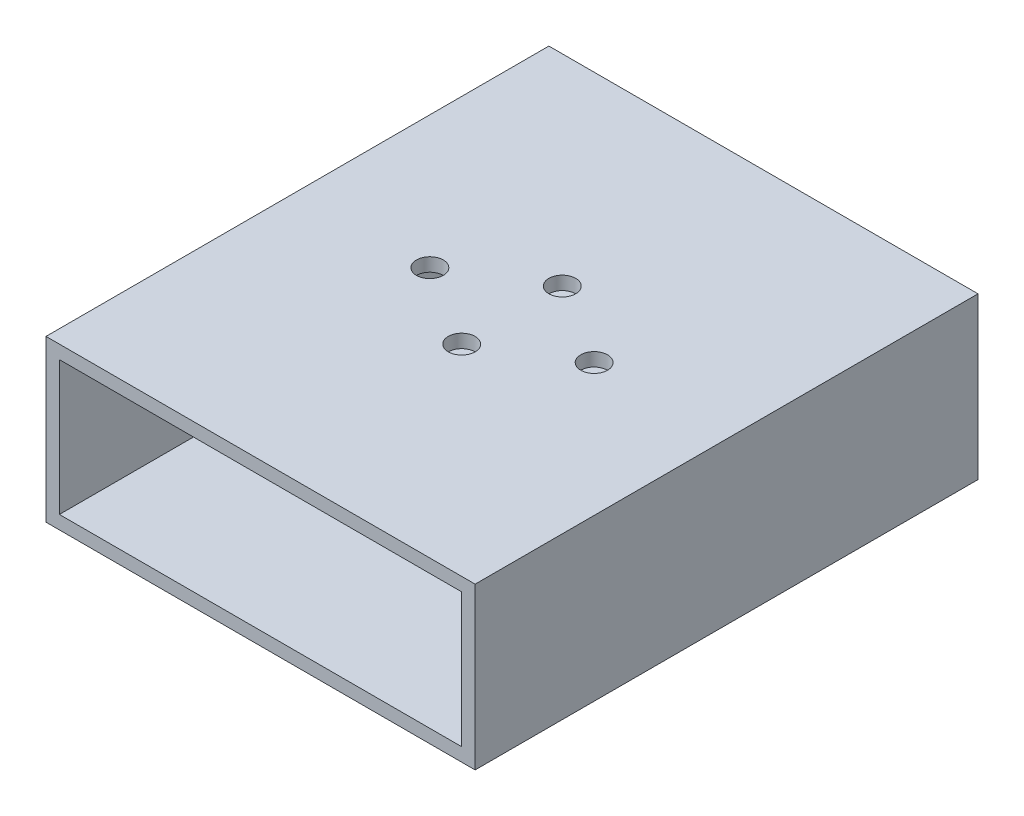
ISO-10303-21;
HEADER;
FILE_DESCRIPTION(('STEP AP214'),'2;1');
FILE_NAME('part.step','',(''),(''),'','','');
FILE_SCHEMA(('AUTOMOTIVE_DESIGN { 1 0 10303 214 1 1 1 1 }'));
ENDSEC;
DATA;
#1=APPLICATION_CONTEXT('core data for automotive mechanical design processes');
#2=APPLICATION_PROTOCOL_DEFINITION('international standard','automotive_design',2000,#1);
#3=PRODUCT_CONTEXT('',#1,'mechanical');
#4=PRODUCT('Part','Part','',(#3));
#5=PRODUCT_RELATED_PRODUCT_CATEGORY('part','',(#4));
#6=PRODUCT_DEFINITION_FORMATION('','',#4);
#7=PRODUCT_DEFINITION_CONTEXT('part definition',#1,'design');
#8=PRODUCT_DEFINITION('design','',#6,#7);
#9=PRODUCT_DEFINITION_SHAPE('','',#8);
#10=(LENGTH_UNIT() NAMED_UNIT(*) SI_UNIT(.MILLI.,.METRE.));
#11=(NAMED_UNIT(*) PLANE_ANGLE_UNIT() SI_UNIT($,.RADIAN.));
#12=(NAMED_UNIT(*) SI_UNIT($,.STERADIAN.) SOLID_ANGLE_UNIT());
#13=UNCERTAINTY_MEASURE_WITH_UNIT(LENGTH_MEASURE(1.E-05),#10,'distance_accuracy_value','');
#14=(GEOMETRIC_REPRESENTATION_CONTEXT(3) GLOBAL_UNCERTAINTY_ASSIGNED_CONTEXT((#13)) GLOBAL_UNIT_ASSIGNED_CONTEXT((#10,
#11,#12)) REPRESENTATION_CONTEXT('',''));
#15=CARTESIAN_POINT('',(0.,0.,0.));
#16=DIRECTION('',(0.,0.,1.));
#17=DIRECTION('',(1.,0.,0.));
#18=AXIS2_PLACEMENT_3D('',#15,#16,#17);
#19=CARTESIAN_POINT('',(0.,0.,150.));
#20=DIRECTION('',(0.,0.,1.));
#21=DIRECTION('',(1.,0.,0.));
#22=AXIS2_PLACEMENT_3D('',#19,#20,#21);
#23=PLANE('',#22);
#24=DIRECTION('',(0.,1.,0.));
#25=VECTOR('',#24,1.);
#26=CARTESIAN_POINT('',(4.,0.,150.));
#27=LINE('',#26,#25);
#28=CARTESIAN_POINT('',(4.,-4.,150.));
#29=VERTEX_POINT('',#28);
#30=CARTESIAN_POINT('',(4.,44.,150.));
#31=VERTEX_POINT('',#30);
#32=EDGE_CURVE('E162',#29,#31,#27,.T.);
#33=ORIENTED_EDGE('',*,*,#32,.T.);
#34=DIRECTION('',(-1.,0.,0.));
#35=VECTOR('',#34,1.);
#36=CARTESIAN_POINT('',(0.,44.,150.));
#37=LINE('',#36,#35);
#38=CARTESIAN_POINT('',(-124.,44.,150.));
#39=VERTEX_POINT('',#38);
#40=EDGE_CURVE('E165',#31,#39,#37,.T.);
#41=ORIENTED_EDGE('',*,*,#40,.T.);
#42=DIRECTION('',(0.,-1.,0.));
#43=VECTOR('',#42,1.);
#44=CARTESIAN_POINT('',(-124.,0.,150.));
#45=LINE('',#44,#43);
#46=CARTESIAN_POINT('',(-124.,-4.00000000000002,150.));
#47=VERTEX_POINT('',#46);
#48=EDGE_CURVE('E168',#39,#47,#45,.T.);
#49=ORIENTED_EDGE('',*,*,#48,.T.);
#50=DIRECTION('',(1.,0.,0.));
#51=VECTOR('',#50,1.);
#52=CARTESIAN_POINT('',(0.,-4.,150.));
#53=LINE('',#52,#51);
#54=EDGE_CURVE('E170',#47,#29,#53,.T.);
#55=ORIENTED_EDGE('',*,*,#54,.T.);
#56=EDGE_LOOP('',(#33,#41,#49,#55));
#57=FACE_BOUND('',#56,.T.);
#58=DIRECTION('',(-1.,0.,0.));
#59=VECTOR('',#58,1.);
#60=CARTESIAN_POINT('',(0.,40.,150.));
#61=LINE('',#60,#59);
#62=CARTESIAN_POINT('',(0.,40.,150.));
#63=VERTEX_POINT('',#62);
#64=CARTESIAN_POINT('',(-120.,40.,150.));
#65=VERTEX_POINT('',#64);
#66=EDGE_CURVE('E132',#63,#65,#61,.T.);
#67=ORIENTED_EDGE('',*,*,#66,.F.);
#68=DIRECTION('',(0.,1.,0.));
#69=VECTOR('',#68,1.);
#70=CARTESIAN_POINT('',(0.,0.,150.));
#71=LINE('',#70,#69);
#72=CARTESIAN_POINT('',(0.,0.,150.));
#73=VERTEX_POINT('',#72);
#74=EDGE_CURVE('E124',#73,#63,#71,.T.);
#75=ORIENTED_EDGE('',*,*,#74,.F.);
#76=DIRECTION('',(1.,0.,0.));
#77=VECTOR('',#76,1.);
#78=CARTESIAN_POINT('',(0.,0.,150.));
#79=LINE('',#78,#77);
#80=CARTESIAN_POINT('',(-120.,0.,150.));
#81=VERTEX_POINT('',#80);
#82=EDGE_CURVE('E146',#81,#73,#79,.T.);
#83=ORIENTED_EDGE('',*,*,#82,.F.);
#84=DIRECTION('',(0.,-1.,0.));
#85=VECTOR('',#84,1.);
#86=CARTESIAN_POINT('',(-120.,0.,150.));
#87=LINE('',#86,#85);
#88=EDGE_CURVE('E144',#65,#81,#87,.T.);
#89=ORIENTED_EDGE('',*,*,#88,.F.);
#90=EDGE_LOOP('',(#67,#75,#83,#89));
#91=FACE_BOUND('',#90,.T.);
#92=ADVANCED_FACE('F59',(#57,#91),#23,.T.);
#93=CARTESIAN_POINT('',(0.,0.,0.));
#94=DIRECTION('',(0.,0.,1.));
#95=DIRECTION('',(1.,0.,0.));
#96=AXIS2_PLACEMENT_3D('',#93,#94,#95);
#97=PLANE('',#96);
#98=DIRECTION('',(0.,1.,0.));
#99=VECTOR('',#98,1.);
#100=CARTESIAN_POINT('',(4.,0.,0.));
#101=LINE('',#100,#99);
#102=CARTESIAN_POINT('',(4.,-4.,0.));
#103=VERTEX_POINT('',#102);
#104=CARTESIAN_POINT('',(4.,44.,0.));
#105=VERTEX_POINT('',#104);
#106=EDGE_CURVE('E140',#103,#105,#101,.T.);
#107=ORIENTED_EDGE('',*,*,#106,.F.);
#108=DIRECTION('',(1.,0.,0.));
#109=VECTOR('',#108,1.);
#110=CARTESIAN_POINT('',(0.,-4.,0.));
#111=LINE('',#110,#109);
#112=CARTESIAN_POINT('',(-124.,-4.00000000000002,0.));
#113=VERTEX_POINT('',#112);
#114=EDGE_CURVE('E166',#113,#103,#111,.T.);
#115=ORIENTED_EDGE('',*,*,#114,.F.);
#116=DIRECTION('',(0.,-1.,0.));
#117=VECTOR('',#116,1.);
#118=CARTESIAN_POINT('',(-124.,0.,0.));
#119=LINE('',#118,#117);
#120=CARTESIAN_POINT('',(-124.,44.,0.));
#121=VERTEX_POINT('',#120);
#122=EDGE_CURVE('E177',#121,#113,#119,.T.);
#123=ORIENTED_EDGE('',*,*,#122,.F.);
#124=DIRECTION('',(-1.,0.,0.));
#125=VECTOR('',#124,1.);
#126=CARTESIAN_POINT('',(0.,44.,0.));
#127=LINE('',#126,#125);
#128=EDGE_CURVE('E175',#105,#121,#127,.T.);
#129=ORIENTED_EDGE('',*,*,#128,.F.);
#130=EDGE_LOOP('',(#107,#115,#123,#129));
#131=FACE_BOUND('',#130,.T.);
#132=DIRECTION('',(0.,1.,0.));
#133=VECTOR('',#132,1.);
#134=CARTESIAN_POINT('',(0.,0.,0.));
#135=LINE('',#134,#133);
#136=CARTESIAN_POINT('',(0.,0.,0.));
#137=VERTEX_POINT('',#136);
#138=CARTESIAN_POINT('',(0.,40.,0.));
#139=VERTEX_POINT('',#138);
#140=EDGE_CURVE('E82',#137,#139,#135,.T.);
#141=ORIENTED_EDGE('',*,*,#140,.T.);
#142=DIRECTION('',(-1.,0.,0.));
#143=VECTOR('',#142,1.);
#144=CARTESIAN_POINT('',(0.,40.,0.));
#145=LINE('',#144,#143);
#146=CARTESIAN_POINT('',(-120.,40.,0.));
#147=VERTEX_POINT('',#146);
#148=EDGE_CURVE('E139',#139,#147,#145,.T.);
#149=ORIENTED_EDGE('',*,*,#148,.T.);
#150=DIRECTION('',(0.,-1.,0.));
#151=VECTOR('',#150,1.);
#152=CARTESIAN_POINT('',(-120.,0.,0.));
#153=LINE('',#152,#151);
#154=CARTESIAN_POINT('',(-120.,0.,0.));
#155=VERTEX_POINT('',#154);
#156=EDGE_CURVE('E154',#147,#155,#153,.T.);
#157=ORIENTED_EDGE('',*,*,#156,.T.);
#158=DIRECTION('',(1.,0.,0.));
#159=VECTOR('',#158,1.);
#160=CARTESIAN_POINT('',(0.,0.,0.));
#161=LINE('',#160,#159);
#162=EDGE_CURVE('E133',#155,#137,#161,.T.);
#163=ORIENTED_EDGE('',*,*,#162,.T.);
#164=EDGE_LOOP('',(#141,#149,#157,#163));
#165=FACE_BOUND('',#164,.T.);
#166=ADVANCED_FACE('F195',(#131,#165),#97,.F.);
#167=CARTESIAN_POINT('',(4.,0.,150.));
#168=DIRECTION('',(-1.,0.,0.));
#169=DIRECTION('',(0.,0.,1.));
#170=AXIS2_PLACEMENT_3D('',#167,#168,#169);
#171=PLANE('',#170);
#172=ORIENTED_EDGE('',*,*,#106,.T.);
#173=DIRECTION('',(0.,0.,-1.));
#174=VECTOR('',#173,1.);
#175=CARTESIAN_POINT('',(4.,44.,150.));
#176=LINE('',#175,#174);
#177=EDGE_CURVE('E12',#31,#105,#176,.T.);
#178=ORIENTED_EDGE('',*,*,#177,.F.);
#179=ORIENTED_EDGE('',*,*,#32,.F.);
#180=DIRECTION('',(0.,0.,-1.));
#181=VECTOR('',#180,1.);
#182=CARTESIAN_POINT('',(4.,-4.,150.));
#183=LINE('',#182,#181);
#184=EDGE_CURVE('E172',#29,#103,#183,.T.);
#185=ORIENTED_EDGE('',*,*,#184,.T.);
#186=EDGE_LOOP('',(#172,#178,#179,#185));
#187=FACE_BOUND('',#186,.T.);
#188=ADVANCED_FACE('F61',(#187),#171,.F.);
#189=CARTESIAN_POINT('',(0.,44.,150.));
#190=DIRECTION('',(0.,-1.,0.));
#191=DIRECTION('',(1.,0.,0.));
#192=AXIS2_PLACEMENT_3D('',#189,#190,#191);
#193=PLANE('',#192);
#194=CARTESIAN_POINT('',(-35.5,44.,75.));
#195=DIRECTION('',(0.,1.,0.));
#196=DIRECTION('',(1.,0.,0.));
#197=AXIS2_PLACEMENT_3D('',#194,#195,#196);
#198=CIRCLE('',#197,4.00000000000001);
#199=CARTESIAN_POINT('',(-31.5,44.,75.));
#200=VERTEX_POINT('',#199);
#201=EDGE_CURVE('E265',#200,#200,#198,.T.);
#202=ORIENTED_EDGE('',*,*,#201,.F.);
#203=EDGE_LOOP('',(#202));
#204=FACE_BOUND('',#203,.T.);
#205=CARTESIAN_POINT('',(-60.,44.,60.));
#206=DIRECTION('',(0.,1.,0.));
#207=DIRECTION('',(-1.,0.,0.));
#208=AXIS2_PLACEMENT_3D('',#205,#206,#207);
#209=CIRCLE('',#208,4.00000000000001);
#210=CARTESIAN_POINT('',(-64.,44.,60.));
#211=VERTEX_POINT('',#210);
#212=EDGE_CURVE('E270',#211,#211,#209,.T.);
#213=ORIENTED_EDGE('',*,*,#212,.F.);
#214=EDGE_LOOP('',(#213));
#215=FACE_BOUND('',#214,.T.);
#216=CARTESIAN_POINT('',(-60.,44.,90.));
#217=DIRECTION('',(0.,1.,0.));
#218=DIRECTION('',(1.,0.,0.));
#219=AXIS2_PLACEMENT_3D('',#216,#217,#218);
#220=CIRCLE('',#219,4.00000000000001);
#221=CARTESIAN_POINT('',(-56.,44.,90.));
#222=VERTEX_POINT('',#221);
#223=EDGE_CURVE('E276',#222,#222,#220,.T.);
#224=ORIENTED_EDGE('',*,*,#223,.F.);
#225=EDGE_LOOP('',(#224));
#226=FACE_BOUND('',#225,.T.);
#227=CARTESIAN_POINT('',(-84.5,44.,75.));
#228=DIRECTION('',(0.,1.,0.));
#229=DIRECTION('',(-1.,0.,0.));
#230=AXIS2_PLACEMENT_3D('',#227,#228,#229);
#231=CIRCLE('',#230,4.00000000000001);
#232=CARTESIAN_POINT('',(-88.5,44.,75.));
#233=VERTEX_POINT('',#232);
#234=EDGE_CURVE('E152',#233,#233,#231,.T.);
#235=ORIENTED_EDGE('',*,*,#234,.F.);
#236=EDGE_LOOP('',(#235));
#237=FACE_BOUND('',#236,.T.);
#238=ORIENTED_EDGE('',*,*,#128,.T.);
#239=DIRECTION('',(0.,0.,-1.));
#240=VECTOR('',#239,1.);
#241=CARTESIAN_POINT('',(-124.,44.,150.));
#242=LINE('',#241,#240);
#243=EDGE_CURVE('E67',#39,#121,#242,.T.);
#244=ORIENTED_EDGE('',*,*,#243,.F.);
#245=ORIENTED_EDGE('',*,*,#40,.F.);
#246=ORIENTED_EDGE('',*,*,#177,.T.);
#247=EDGE_LOOP('',(#238,#244,#245,#246));
#248=FACE_BOUND('',#247,.T.);
#249=ADVANCED_FACE('F205',(#204,#215,#226,#237,#248),#193,.F.);
#250=CARTESIAN_POINT('',(-124.,0.,150.));
#251=DIRECTION('',(1.,0.,0.));
#252=DIRECTION('',(0.,0.,-1.));
#253=AXIS2_PLACEMENT_3D('',#250,#251,#252);
#254=PLANE('',#253);
#255=ORIENTED_EDGE('',*,*,#122,.T.);
#256=DIRECTION('',(0.,0.,-1.));
#257=VECTOR('',#256,1.);
#258=CARTESIAN_POINT('',(-124.,-4.00000000000002,150.));
#259=LINE('',#258,#257);
#260=EDGE_CURVE('E182',#47,#113,#259,.T.);
#261=ORIENTED_EDGE('',*,*,#260,.F.);
#262=ORIENTED_EDGE('',*,*,#48,.F.);
#263=ORIENTED_EDGE('',*,*,#243,.T.);
#264=EDGE_LOOP('',(#255,#261,#262,#263));
#265=FACE_BOUND('',#264,.T.);
#266=ADVANCED_FACE('F189',(#265),#254,.F.);
#267=CARTESIAN_POINT('',(0.,-4.,150.));
#268=DIRECTION('',(0.,1.,0.));
#269=DIRECTION('',(-1.,0.,0.));
#270=AXIS2_PLACEMENT_3D('',#267,#268,#269);
#271=PLANE('',#270);
#272=ORIENTED_EDGE('',*,*,#114,.T.);
#273=ORIENTED_EDGE('',*,*,#184,.F.);
#274=ORIENTED_EDGE('',*,*,#54,.F.);
#275=ORIENTED_EDGE('',*,*,#260,.T.);
#276=EDGE_LOOP('',(#272,#273,#274,#275));
#277=FACE_BOUND('',#276,.T.);
#278=ADVANCED_FACE('F199',(#277),#271,.F.);
#279=CARTESIAN_POINT('',(0.,0.,150.));
#280=DIRECTION('',(-1.,0.,0.));
#281=DIRECTION('',(0.,0.,1.));
#282=AXIS2_PLACEMENT_3D('',#279,#280,#281);
#283=PLANE('',#282);
#284=ORIENTED_EDGE('',*,*,#140,.F.);
#285=DIRECTION('',(0.,0.,-1.));
#286=VECTOR('',#285,1.);
#287=CARTESIAN_POINT('',(0.,0.,150.));
#288=LINE('',#287,#286);
#289=EDGE_CURVE('E128',#73,#137,#288,.T.);
#290=ORIENTED_EDGE('',*,*,#289,.F.);
#291=ORIENTED_EDGE('',*,*,#74,.T.);
#292=DIRECTION('',(0.,0.,-1.));
#293=VECTOR('',#292,1.);
#294=CARTESIAN_POINT('',(0.,40.,150.));
#295=LINE('',#294,#293);
#296=EDGE_CURVE('E127',#63,#139,#295,.T.);
#297=ORIENTED_EDGE('',*,*,#296,.T.);
#298=EDGE_LOOP('',(#284,#290,#291,#297));
#299=FACE_BOUND('',#298,.T.);
#300=ADVANCED_FACE('F126',(#299),#283,.T.);
#301=CARTESIAN_POINT('',(0.,40.,150.));
#302=DIRECTION('',(0.,-1.,0.));
#303=DIRECTION('',(1.,0.,0.));
#304=AXIS2_PLACEMENT_3D('',#301,#302,#303);
#305=PLANE('',#304);
#306=CARTESIAN_POINT('',(-35.5,40.,75.));
#307=DIRECTION('',(0.,-1.,0.));
#308=DIRECTION('',(1.,0.,0.));
#309=AXIS2_PLACEMENT_3D('',#306,#307,#308);
#310=CIRCLE('',#309,4.00000000000001);
#311=CARTESIAN_POINT('',(-31.5,40.,75.));
#312=VERTEX_POINT('',#311);
#313=EDGE_CURVE('E263',#312,#312,#310,.F.);
#314=ORIENTED_EDGE('',*,*,#313,.T.);
#315=EDGE_LOOP('',(#314));
#316=FACE_BOUND('',#315,.T.);
#317=CARTESIAN_POINT('',(-60.,40.,60.));
#318=DIRECTION('',(0.,-1.,0.));
#319=DIRECTION('',(1.,0.,0.));
#320=AXIS2_PLACEMENT_3D('',#317,#318,#319);
#321=CIRCLE('',#320,4.00000000000001);
#322=CARTESIAN_POINT('',(-56.,40.,60.));
#323=VERTEX_POINT('',#322);
#324=EDGE_CURVE('E273',#323,#323,#321,.F.);
#325=ORIENTED_EDGE('',*,*,#324,.T.);
#326=EDGE_LOOP('',(#325));
#327=FACE_BOUND('',#326,.T.);
#328=CARTESIAN_POINT('',(-60.,40.,90.));
#329=DIRECTION('',(0.,-1.,0.));
#330=DIRECTION('',(1.,0.,0.));
#331=AXIS2_PLACEMENT_3D('',#328,#329,#330);
#332=CIRCLE('',#331,4.00000000000001);
#333=CARTESIAN_POINT('',(-56.,40.,90.));
#334=VERTEX_POINT('',#333);
#335=EDGE_CURVE('E279',#334,#334,#332,.F.);
#336=ORIENTED_EDGE('',*,*,#335,.T.);
#337=EDGE_LOOP('',(#336));
#338=FACE_BOUND('',#337,.T.);
#339=CARTESIAN_POINT('',(-84.5,40.,75.));
#340=DIRECTION('',(0.,-1.,0.));
#341=DIRECTION('',(1.,0.,0.));
#342=AXIS2_PLACEMENT_3D('',#339,#340,#341);
#343=CIRCLE('',#342,4.00000000000001);
#344=CARTESIAN_POINT('',(-80.5,40.,75.));
#345=VERTEX_POINT('',#344);
#346=EDGE_CURVE('E266',#345,#345,#343,.F.);
#347=ORIENTED_EDGE('',*,*,#346,.T.);
#348=EDGE_LOOP('',(#347));
#349=FACE_BOUND('',#348,.T.);
#350=ORIENTED_EDGE('',*,*,#148,.F.);
#351=ORIENTED_EDGE('',*,*,#296,.F.);
#352=ORIENTED_EDGE('',*,*,#66,.T.);
#353=DIRECTION('',(0.,0.,-1.));
#354=VECTOR('',#353,1.);
#355=CARTESIAN_POINT('',(-120.,40.,150.));
#356=LINE('',#355,#354);
#357=EDGE_CURVE('E141',#65,#147,#356,.T.);
#358=ORIENTED_EDGE('',*,*,#357,.T.);
#359=EDGE_LOOP('',(#350,#351,#352,#358));
#360=FACE_BOUND('',#359,.T.);
#361=ADVANCED_FACE('F136',(#316,#327,#338,#349,#360),#305,.T.);
#362=CARTESIAN_POINT('',(-120.,0.,150.));
#363=DIRECTION('',(1.,0.,0.));
#364=DIRECTION('',(0.,0.,-1.));
#365=AXIS2_PLACEMENT_3D('',#362,#363,#364);
#366=PLANE('',#365);
#367=ORIENTED_EDGE('',*,*,#156,.F.);
#368=ORIENTED_EDGE('',*,*,#357,.F.);
#369=ORIENTED_EDGE('',*,*,#88,.T.);
#370=DIRECTION('',(0.,0.,-1.));
#371=VECTOR('',#370,1.);
#372=CARTESIAN_POINT('',(-120.,0.,150.));
#373=LINE('',#372,#371);
#374=EDGE_CURVE('E74',#81,#155,#373,.T.);
#375=ORIENTED_EDGE('',*,*,#374,.T.);
#376=EDGE_LOOP('',(#367,#368,#369,#375));
#377=FACE_BOUND('',#376,.T.);
#378=ADVANCED_FACE('F231',(#377),#366,.T.);
#379=CARTESIAN_POINT('',(0.,0.,150.));
#380=DIRECTION('',(0.,1.,0.));
#381=DIRECTION('',(-1.,0.,0.));
#382=AXIS2_PLACEMENT_3D('',#379,#380,#381);
#383=PLANE('',#382);
#384=ORIENTED_EDGE('',*,*,#162,.F.);
#385=ORIENTED_EDGE('',*,*,#374,.F.);
#386=ORIENTED_EDGE('',*,*,#82,.T.);
#387=ORIENTED_EDGE('',*,*,#289,.T.);
#388=EDGE_LOOP('',(#384,#385,#386,#387));
#389=FACE_BOUND('',#388,.T.);
#390=ADVANCED_FACE('F236',(#389),#383,.T.);
#391=CARTESIAN_POINT('',(-84.5,-4.00100000000003,75.));
#392=DIRECTION('',(0.,1.,0.));
#393=DIRECTION('',(-1.,0.,0.));
#394=AXIS2_PLACEMENT_3D('',#391,#392,#393);
#395=CYLINDRICAL_SURFACE('',#394,4.00000000000001);
#396=ORIENTED_EDGE('',*,*,#346,.F.);
#397=EDGE_LOOP('',(#396));
#398=FACE_BOUND('',#397,.T.);
#399=ORIENTED_EDGE('',*,*,#234,.T.);
#400=EDGE_LOOP('',(#399));
#401=FACE_BOUND('',#400,.T.);
#402=ADVANCED_FACE('F244',(#398,#401),#395,.F.);
#403=CARTESIAN_POINT('',(-60.,-4.00100000000003,90.));
#404=DIRECTION('',(0.,1.,0.));
#405=DIRECTION('',(-1.,0.,0.));
#406=AXIS2_PLACEMENT_3D('',#403,#404,#405);
#407=CYLINDRICAL_SURFACE('',#406,4.00000000000001);
#408=ORIENTED_EDGE('',*,*,#335,.F.);
#409=EDGE_LOOP('',(#408));
#410=FACE_BOUND('',#409,.T.);
#411=ORIENTED_EDGE('',*,*,#223,.T.);
#412=EDGE_LOOP('',(#411));
#413=FACE_BOUND('',#412,.T.);
#414=ADVANCED_FACE('F247',(#410,#413),#407,.F.);
#415=CARTESIAN_POINT('',(-60.,-4.00100000000003,60.));
#416=DIRECTION('',(0.,1.,0.));
#417=DIRECTION('',(-1.,0.,0.));
#418=AXIS2_PLACEMENT_3D('',#415,#416,#417);
#419=CYLINDRICAL_SURFACE('',#418,4.00000000000001);
#420=ORIENTED_EDGE('',*,*,#324,.F.);
#421=EDGE_LOOP('',(#420));
#422=FACE_BOUND('',#421,.T.);
#423=ORIENTED_EDGE('',*,*,#212,.T.);
#424=EDGE_LOOP('',(#423));
#425=FACE_BOUND('',#424,.T.);
#426=ADVANCED_FACE('F251',(#422,#425),#419,.F.);
#427=CARTESIAN_POINT('',(-35.5,-4.00100000000003,75.));
#428=DIRECTION('',(0.,1.,0.));
#429=DIRECTION('',(-1.,0.,0.));
#430=AXIS2_PLACEMENT_3D('',#427,#428,#429);
#431=CYLINDRICAL_SURFACE('',#430,4.00000000000001);
#432=ORIENTED_EDGE('',*,*,#313,.F.);
#433=EDGE_LOOP('',(#432));
#434=FACE_BOUND('',#433,.T.);
#435=ORIENTED_EDGE('',*,*,#201,.T.);
#436=EDGE_LOOP('',(#435));
#437=FACE_BOUND('',#436,.T.);
#438=ADVANCED_FACE('F255',(#434,#437),#431,.F.);
#439=CLOSED_SHELL('',(#92,#166,#188,#249,#266,#278,#300,#361,#378,#390,#402,#414,#426,#438));
#440=MANIFOLD_SOLID_BREP('B2',#439);
#441=ADVANCED_BREP_SHAPE_REPRESENTATION('',(#18,#440),#14);
#442=SHAPE_DEFINITION_REPRESENTATION(#9,#441);
ENDSEC;
END-ISO-10303-21;
